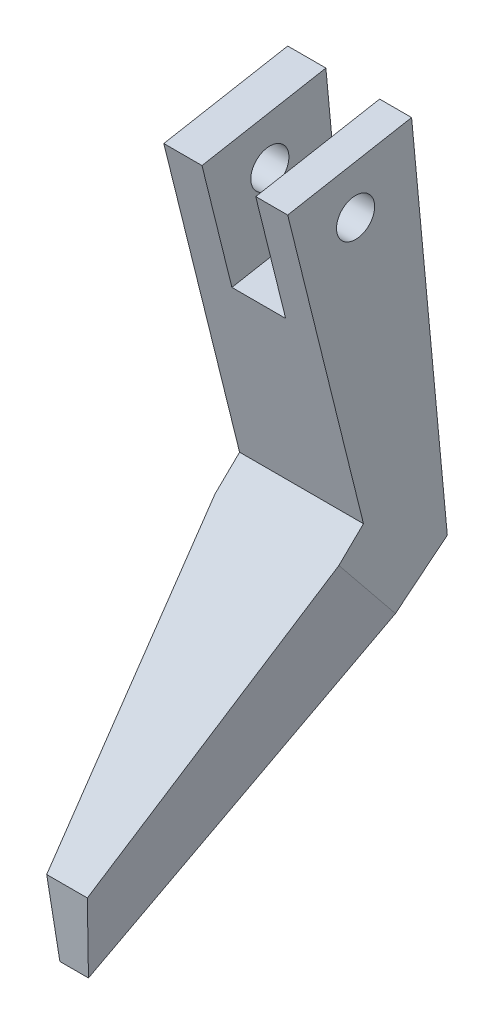
ISO-10303-21;
HEADER;
FILE_DESCRIPTION(('STEP AP214'),'2;1');
FILE_NAME('part.step','',(''),(''),'','','');
FILE_SCHEMA(('AUTOMOTIVE_DESIGN { 1 0 10303 214 1 1 1 1 }'));
ENDSEC;
DATA;
#1=APPLICATION_CONTEXT('core data for automotive mechanical design processes');
#2=APPLICATION_PROTOCOL_DEFINITION('international standard','automotive_design',2000,#1);
#3=PRODUCT_CONTEXT('',#1,'mechanical');
#4=PRODUCT('Part','Part','',(#3));
#5=PRODUCT_RELATED_PRODUCT_CATEGORY('part','',(#4));
#6=PRODUCT_DEFINITION_FORMATION('','',#4);
#7=PRODUCT_DEFINITION_CONTEXT('part definition',#1,'design');
#8=PRODUCT_DEFINITION('design','',#6,#7);
#9=PRODUCT_DEFINITION_SHAPE('','',#8);
#10=(LENGTH_UNIT() NAMED_UNIT(*) SI_UNIT(.MILLI.,.METRE.));
#11=(NAMED_UNIT(*) PLANE_ANGLE_UNIT() SI_UNIT($,.RADIAN.));
#12=(NAMED_UNIT(*) SI_UNIT($,.STERADIAN.) SOLID_ANGLE_UNIT());
#13=UNCERTAINTY_MEASURE_WITH_UNIT(LENGTH_MEASURE(1.E-05),#10,'distance_accuracy_value','');
#14=(GEOMETRIC_REPRESENTATION_CONTEXT(3) GLOBAL_UNCERTAINTY_ASSIGNED_CONTEXT((#13)) GLOBAL_UNIT_ASSIGNED_CONTEXT((#10,
#11,#12)) REPRESENTATION_CONTEXT('',''));
#15=CARTESIAN_POINT('',(0.,0.,0.));
#16=DIRECTION('',(0.,0.,1.));
#17=DIRECTION('',(1.,0.,0.));
#18=AXIS2_PLACEMENT_3D('',#15,#16,#17);
#19=CARTESIAN_POINT('',(130.,203.995173876658,117.413418414322));
#20=DIRECTION('',(0.,-0.983927715527539,-0.178567215962946));
#21=DIRECTION('',(0.,0.178567215962946,-0.98392771552754));
#22=AXIS2_PLACEMENT_3D('',#19,#20,#21);
#23=PLANE('',#22);
#24=DIRECTION('',(-1.,0.,0.));
#25=VECTOR('',#24,1.);
#26=CARTESIAN_POINT('',(130.,227.588104240183,-12.586581585678));
#27=LINE('',#26,#25);
#28=CARTESIAN_POINT('',(130.,227.588104240183,-12.586581585678));
#29=VERTEX_POINT('',#28);
#30=CARTESIAN_POINT('',(96.4614608723713,227.588104240183,-12.586581585678));
#31=VERTEX_POINT('',#30);
#32=EDGE_CURVE('E159',#29,#31,#27,.T.);
#33=ORIENTED_EDGE('',*,*,#32,.T.);
#34=DIRECTION('',(0.,0.178567215962946,-0.983927715527539));
#35=VECTOR('',#34,1.);
#36=CARTESIAN_POINT('',(96.4614608723713,203.995173876658,117.413418414322));
#37=LINE('',#36,#35);
#38=CARTESIAN_POINT('',(96.4614608723713,203.995173876658,117.413418414322));
#39=VERTEX_POINT('',#38);
#40=EDGE_CURVE('E133',#39,#31,#37,.T.);
#41=ORIENTED_EDGE('',*,*,#40,.F.);
#42=DIRECTION('',(-1.,0.,0.));
#43=VECTOR('',#42,1.);
#44=CARTESIAN_POINT('',(130.,203.995173876658,117.413418414322));
#45=LINE('',#44,#43);
#46=CARTESIAN_POINT('',(130.,203.995173876658,117.413418414322));
#47=VERTEX_POINT('',#46);
#48=EDGE_CURVE('E150',#47,#39,#45,.T.);
#49=ORIENTED_EDGE('',*,*,#48,.F.);
#50=DIRECTION('',(0.,-0.178567215962946,0.983927715527539));
#51=VECTOR('',#50,1.);
#52=CARTESIAN_POINT('',(130.,203.995173876658,117.413418414322));
#53=LINE('',#52,#51);
#54=EDGE_CURVE('E151',#29,#47,#53,.T.);
#55=ORIENTED_EDGE('',*,*,#54,.F.);
#56=EDGE_LOOP('',(#33,#41,#49,#55));
#57=FACE_BOUND('',#56,.T.);
#58=ADVANCED_FACE('F38',(#57),#23,.F.);
#59=CARTESIAN_POINT('',(130.,-116.282866202972,37.9025572521483));
#60=DIRECTION('',(0.,0.240942003521738,-0.97053951539282));
#61=DIRECTION('',(0.,0.970539515392821,0.240942003521738));
#62=AXIS2_PLACEMENT_3D('',#59,#60,#61);
#63=PLANE('',#62);
#64=ORIENTED_EDGE('',*,*,#48,.T.);
#65=DIRECTION('',(0.,-0.970539515392821,-0.240942003521738));
#66=VECTOR('',#65,1.);
#67=CARTESIAN_POINT('',(96.4614608723713,-116.282866202972,37.9025572521483));
#68=LINE('',#67,#66);
#69=CARTESIAN_POINT('',(96.4614608723713,77.567766075428,86.02708900417));
#70=VERTEX_POINT('',#69);
#71=EDGE_CURVE('E223',#39,#70,#68,.T.);
#72=ORIENTED_EDGE('',*,*,#71,.T.);
#73=DIRECTION('',(1.,0.,0.));
#74=VECTOR('',#73,1.);
#75=CARTESIAN_POINT('',(130.,77.567766075428,86.02708900417));
#76=LINE('',#75,#74);
#77=CARTESIAN_POINT('',(40.0610371133642,77.567766075428,86.02708900417));
#78=VERTEX_POINT('',#77);
#79=EDGE_CURVE('E143',#78,#70,#76,.T.);
#80=ORIENTED_EDGE('',*,*,#79,.F.);
#81=DIRECTION('',(0.,0.970539515392821,0.240942003521738));
#82=VECTOR('',#81,1.);
#83=CARTESIAN_POINT('',(40.0610371133642,-116.282866202972,37.9025572521483));
#84=LINE('',#83,#82);
#85=CARTESIAN_POINT('',(40.0610371133642,203.995173876658,117.413418414322));
#86=VERTEX_POINT('',#85);
#87=EDGE_CURVE('E128',#78,#86,#84,.T.);
#88=ORIENTED_EDGE('',*,*,#87,.T.);
#89=CARTESIAN_POINT('',(0.,203.995173876658,117.413418414322));
#90=VERTEX_POINT('',#89);
#91=EDGE_CURVE('E140',#86,#90,#45,.T.);
#92=ORIENTED_EDGE('',*,*,#91,.T.);
#93=DIRECTION('',(0.,-0.97053951539282,-0.240942003521738));
#94=VECTOR('',#93,1.);
#95=CARTESIAN_POINT('',(0.,-116.282866202972,37.9025572521483));
#96=LINE('',#95,#94);
#97=CARTESIAN_POINT('',(0.,-116.282866202972,37.9025572521483));
#98=VERTEX_POINT('',#97);
#99=EDGE_CURVE('E195',#90,#98,#96,.T.);
#100=ORIENTED_EDGE('',*,*,#99,.T.);
#101=DIRECTION('',(-1.,0.,0.));
#102=VECTOR('',#101,1.);
#103=CARTESIAN_POINT('',(130.,-116.282866202972,37.9025572521483));
#104=LINE('',#103,#102);
#105=CARTESIAN_POINT('',(130.,-116.282866202972,37.9025572521483));
#106=VERTEX_POINT('',#105);
#107=EDGE_CURVE('E171',#106,#98,#104,.T.);
#108=ORIENTED_EDGE('',*,*,#107,.F.);
#109=DIRECTION('',(0.,-0.97053951539282,-0.240942003521738));
#110=VECTOR('',#109,1.);
#111=CARTESIAN_POINT('',(130.,-116.282866202972,37.9025572521483));
#112=LINE('',#111,#110);
#113=EDGE_CURVE('E191',#47,#106,#112,.T.);
#114=ORIENTED_EDGE('',*,*,#113,.F.);
#115=EDGE_LOOP('',(#64,#72,#80,#88,#92,#100,#108,#114));
#116=FACE_BOUND('',#115,.T.);
#117=ADVANCED_FACE('F40',(#116),#63,.F.);
#118=CARTESIAN_POINT('',(130.,-355.150417332349,283.977318975946));
#119=DIRECTION('',(0.,-0.717536559192002,-0.696520844069223));
#120=DIRECTION('',(0.,0.696520844069223,-0.717536559192002));
#121=AXIS2_PLACEMENT_3D('',#118,#119,#120);
#122=PLANE('',#121);
#123=DIRECTION('',(-1.,0.,0.));
#124=VECTOR('',#123,1.);
#125=CARTESIAN_POINT('',(130.,-355.150417332349,283.977318975946));
#126=LINE('',#125,#124);
#127=CARTESIAN_POINT('',(86.3237385901728,-355.150417332349,283.977318975946));
#128=VERTEX_POINT('',#127);
#129=CARTESIAN_POINT('',(43.6762614098272,-355.150417332349,283.977318975946));
#130=VERTEX_POINT('',#129);
#131=EDGE_CURVE('E168',#128,#130,#126,.T.);
#132=ORIENTED_EDGE('',*,*,#131,.F.);
#133=DIRECTION('',(0.140855660423099,0.689576630461711,-0.710382821898056));
#134=VECTOR('',#133,1.);
#135=CARTESIAN_POINT('',(87.190289465117,-350.908108356815,279.607009298564));
#136=LINE('',#135,#134);
#137=CARTESIAN_POINT('',(130.,-141.327777307197,63.7031337776207));
#138=VERTEX_POINT('',#137);
#139=EDGE_CURVE('E198',#128,#138,#136,.T.);
#140=ORIENTED_EDGE('',*,*,#139,.T.);
#141=DIRECTION('',(0.,-0.696520844069223,0.717536559192002));
#142=VECTOR('',#141,1.);
#143=CARTESIAN_POINT('',(130.,-355.150417332349,283.977318975946));
#144=LINE('',#143,#142);
#145=EDGE_CURVE('E183',#106,#138,#144,.T.);
#146=ORIENTED_EDGE('',*,*,#145,.F.);
#147=ORIENTED_EDGE('',*,*,#107,.T.);
#148=DIRECTION('',(0.,-0.696520844069223,0.717536559192002));
#149=VECTOR('',#148,1.);
#150=CARTESIAN_POINT('',(0.,-355.150417332349,283.977318975946));
#151=LINE('',#150,#149);
#152=CARTESIAN_POINT('',(0.,-141.327777307197,63.7031337776207));
#153=VERTEX_POINT('',#152);
#154=EDGE_CURVE('E197',#98,#153,#151,.T.);
#155=ORIENTED_EDGE('',*,*,#154,.T.);
#156=DIRECTION('',(0.140855660423099,-0.689576630461711,0.710382821898056));
#157=VECTOR('',#156,1.);
#158=CARTESIAN_POINT('',(45.3889517544026,-363.535108677298,292.614996697682));
#159=LINE('',#158,#157);
#160=EDGE_CURVE('E213',#153,#130,#159,.T.);
#161=ORIENTED_EDGE('',*,*,#160,.T.);
#162=EDGE_LOOP('',(#132,#140,#146,#147,#155,#161));
#163=FACE_BOUND('',#162,.T.);
#164=ADVANCED_FACE('F266',(#163),#122,.F.);
#165=CARTESIAN_POINT('',(130.,-434.798684306352,276.483750531074));
#166=DIRECTION('',(0.,0.0936696055608934,-0.995603337175035));
#167=DIRECTION('',(0.,0.995603337175035,0.0936696055608935));
#168=AXIS2_PLACEMENT_3D('',#165,#166,#167);
#169=PLANE('',#168);
#170=DIRECTION('',(-1.,0.,0.));
#171=VECTOR('',#170,1.);
#172=CARTESIAN_POINT('',(130.,-434.798684306352,276.483750531074));
#173=LINE('',#172,#171);
#174=CARTESIAN_POINT('',(80.,-434.798684306352,276.483750531074));
#175=VERTEX_POINT('',#174);
#176=CARTESIAN_POINT('',(50.,-434.798684306352,276.483750531074));
#177=VERTEX_POINT('',#176);
#178=EDGE_CURVE('E165',#175,#177,#173,.T.);
#179=ORIENTED_EDGE('',*,*,#178,.F.);
#180=DIRECTION('',(0.0788009264529344,0.992507381262661,0.0933783279422699));
#181=VECTOR('',#180,1.);
#182=CARTESIAN_POINT('',(80.310479300492,-430.888159248608,276.851665468698));
#183=LINE('',#182,#181);
#184=EDGE_CURVE('E210',#175,#128,#183,.T.);
#185=ORIENTED_EDGE('',*,*,#184,.T.);
#186=ORIENTED_EDGE('',*,*,#131,.T.);
#187=DIRECTION('',(0.0788009264529344,-0.992507381262661,-0.0933783279422699));
#188=VECTOR('',#187,1.);
#189=CARTESIAN_POINT('',(50.4967668807873,-441.055524398742,275.895086630876));
#190=LINE('',#189,#188);
#191=EDGE_CURVE('E216',#130,#177,#190,.T.);
#192=ORIENTED_EDGE('',*,*,#191,.T.);
#193=EDGE_LOOP('',(#179,#185,#186,#192));
#194=FACE_BOUND('',#193,.T.);
#195=ADVANCED_FACE('F280',(#194),#169,.F.);
#196=CARTESIAN_POINT('',(130.,-170.653230629831,-50.0544238100355));
#197=DIRECTION('',(0.,0.777471843669309,0.628917746848859));
#198=DIRECTION('',(0.,-0.628917746848859,0.777471843669309));
#199=AXIS2_PLACEMENT_3D('',#196,#197,#198);
#200=PLANE('',#199);
#201=DIRECTION('',(0.,0.628917746848859,-0.777471843669309));
#202=VECTOR('',#201,1.);
#203=CARTESIAN_POINT('',(130.,-170.653230629831,-50.0544238100355));
#204=LINE('',#203,#202);
#205=CARTESIAN_POINT('',(130.,-214.677472909251,4.3686052468162));
#206=VERTEX_POINT('',#205);
#207=CARTESIAN_POINT('',(130.,-170.653230629831,-50.0544238100355));
#208=VERTEX_POINT('',#207);
#209=EDGE_CURVE('E180',#206,#208,#204,.T.);
#210=ORIENTED_EDGE('',*,*,#209,.F.);
#211=DIRECTION('',(0.14142135623731,0.62259680504755,-0.769657857976246));
#212=VECTOR('',#211,1.);
#213=CARTESIAN_POINT('',(130.,-214.677472909251,4.36860524681608));
#214=LINE('',#213,#212);
#215=EDGE_CURVE('E62',#175,#206,#214,.T.);
#216=ORIENTED_EDGE('',*,*,#215,.F.);
#217=ORIENTED_EDGE('',*,*,#178,.T.);
#218=DIRECTION('',(0.14142135623731,-0.62259680504755,0.769657857976246));
#219=VECTOR('',#218,1.);
#220=CARTESIAN_POINT('',(50.,-434.798684306352,276.483750531074));
#221=LINE('',#220,#219);
#222=CARTESIAN_POINT('',(0.,-214.677472909251,4.36860524681608));
#223=VERTEX_POINT('',#222);
#224=EDGE_CURVE('E219',#223,#177,#221,.T.);
#225=ORIENTED_EDGE('',*,*,#224,.F.);
#226=DIRECTION('',(0.,0.628917746848859,-0.777471843669309));
#227=VECTOR('',#226,1.);
#228=CARTESIAN_POINT('',(0.,-170.653230629831,-50.0544238100355));
#229=LINE('',#228,#227);
#230=CARTESIAN_POINT('',(0.,-170.653230629831,-50.0544238100355));
#231=VERTEX_POINT('',#230);
#232=EDGE_CURVE('E201',#223,#231,#229,.T.);
#233=ORIENTED_EDGE('',*,*,#232,.T.);
#234=DIRECTION('',(-1.,0.,0.));
#235=VECTOR('',#234,1.);
#236=CARTESIAN_POINT('',(130.,-170.653230629831,-50.0544238100355));
#237=LINE('',#236,#235);
#238=EDGE_CURVE('E162',#208,#231,#237,.T.);
#239=ORIENTED_EDGE('',*,*,#238,.F.);
#240=EDGE_LOOP('',(#210,#216,#217,#225,#233,#239));
#241=FACE_BOUND('',#240,.T.);
#242=ADVANCED_FACE('F186',(#241),#200,.F.);
#243=CARTESIAN_POINT('',(130.,227.588104240183,-12.586581585678));
#244=DIRECTION('',(0.,-0.0936696055608935,0.995603337175035));
#245=DIRECTION('',(0.,-0.995603337175035,-0.0936696055608935));
#246=AXIS2_PLACEMENT_3D('',#243,#244,#245);
#247=PLANE('',#246);
#248=DIRECTION('',(-1.,0.,0.));
#249=VECTOR('',#248,1.);
#250=CARTESIAN_POINT('',(130.,97.6826625363831,-24.8085087631573));
#251=LINE('',#250,#249);
#252=CARTESIAN_POINT('',(96.4614608723713,97.6826625363831,-24.8085087631573));
#253=VERTEX_POINT('',#252);
#254=CARTESIAN_POINT('',(40.0610371133642,97.6826625363831,-24.8085087631573));
#255=VERTEX_POINT('',#254);
#256=EDGE_CURVE('E11',#253,#255,#251,.T.);
#257=ORIENTED_EDGE('',*,*,#256,.F.);
#258=DIRECTION('',(0.,0.995603337175035,0.0936696055608935));
#259=VECTOR('',#258,1.);
#260=CARTESIAN_POINT('',(96.4614608723713,227.588104240183,-12.586581585678));
#261=LINE('',#260,#259);
#262=EDGE_CURVE('E144',#253,#31,#261,.T.);
#263=ORIENTED_EDGE('',*,*,#262,.T.);
#264=ORIENTED_EDGE('',*,*,#32,.F.);
#265=DIRECTION('',(0.,0.995603337175035,0.0936696055608935));
#266=VECTOR('',#265,1.);
#267=CARTESIAN_POINT('',(130.,227.588104240183,-12.586581585678));
#268=LINE('',#267,#266);
#269=EDGE_CURVE('E154',#208,#29,#268,.T.);
#270=ORIENTED_EDGE('',*,*,#269,.F.);
#271=ORIENTED_EDGE('',*,*,#238,.T.);
#272=DIRECTION('',(0.,0.995603337175035,0.0936696055608935));
#273=VECTOR('',#272,1.);
#274=CARTESIAN_POINT('',(0.,227.588104240183,-12.586581585678));
#275=LINE('',#274,#273);
#276=CARTESIAN_POINT('',(0.,227.588104240183,-12.586581585678));
#277=VERTEX_POINT('',#276);
#278=EDGE_CURVE('E202',#231,#277,#275,.T.);
#279=ORIENTED_EDGE('',*,*,#278,.T.);
#280=CARTESIAN_POINT('',(40.0610371133642,227.588104240183,-12.586581585678));
#281=VERTEX_POINT('',#280);
#282=EDGE_CURVE('E153',#281,#277,#27,.T.);
#283=ORIENTED_EDGE('',*,*,#282,.F.);
#284=DIRECTION('',(0.,-0.995603337175035,-0.0936696055608935));
#285=VECTOR('',#284,1.);
#286=CARTESIAN_POINT('',(40.0610371133642,227.588104240183,-12.586581585678));
#287=LINE('',#286,#285);
#288=EDGE_CURVE('E54',#281,#255,#287,.T.);
#289=ORIENTED_EDGE('',*,*,#288,.T.);
#290=EDGE_LOOP('',(#257,#263,#264,#270,#271,#279,#283,#289));
#291=FACE_BOUND('',#290,.T.);
#292=ADVANCED_FACE('F270',(#291),#247,.F.);
#293=ORIENTED_EDGE('',*,*,#91,.F.);
#294=DIRECTION('',(0.,-0.178567215962946,0.983927715527539));
#295=VECTOR('',#294,1.);
#296=CARTESIAN_POINT('',(40.0610371133642,227.588104240183,-12.586581585678));
#297=LINE('',#296,#295);
#298=EDGE_CURVE('E125',#281,#86,#297,.T.);
#299=ORIENTED_EDGE('',*,*,#298,.F.);
#300=ORIENTED_EDGE('',*,*,#282,.T.);
#301=DIRECTION('',(0.,-0.178567215962946,0.983927715527539));
#302=VECTOR('',#301,1.);
#303=CARTESIAN_POINT('',(0.,203.995173876658,117.413418414322));
#304=LINE('',#303,#302);
#305=EDGE_CURVE('E148',#277,#90,#304,.T.);
#306=ORIENTED_EDGE('',*,*,#305,.T.);
#307=EDGE_LOOP('',(#293,#299,#300,#306));
#308=FACE_BOUND('',#307,.T.);
#309=ADVANCED_FACE('F146',(#308),#23,.F.);
#310=CARTESIAN_POINT('',(130.,0.,0.));
#311=DIRECTION('',(-1.,0.,0.));
#312=DIRECTION('',(0.,0.,1.));
#313=AXIS2_PLACEMENT_3D('',#310,#311,#312);
#314=PLANE('',#313);
#315=CARTESIAN_POINT('',(130.,166.178708674821,46.2039789265663));
#316=DIRECTION('',(-1.,0.,0.));
#317=DIRECTION('',(0.,0.,1.));
#318=AXIS2_PLACEMENT_3D('',#315,#316,#317);
#319=CIRCLE('',#318,20.);
#320=CARTESIAN_POINT('',(130.,166.178708674821,66.2039789265663));
#321=VERTEX_POINT('',#320);
#322=EDGE_CURVE('E239',#321,#321,#319,.T.);
#323=ORIENTED_EDGE('',*,*,#322,.T.);
#324=EDGE_LOOP('',(#323));
#325=FACE_BOUND('',#324,.T.);
#326=ORIENTED_EDGE('',*,*,#145,.T.);
#327=DIRECTION('',(0.,-0.777471843669309,-0.628917746848859));
#328=VECTOR('',#327,1.);
#329=CARTESIAN_POINT('',(130.,-87.0490966100679,107.610608812159));
#330=LINE('',#329,#328);
#331=EDGE_CURVE('E47',#138,#206,#330,.T.);
#332=ORIENTED_EDGE('',*,*,#331,.T.);
#333=ORIENTED_EDGE('',*,*,#209,.T.);
#334=ORIENTED_EDGE('',*,*,#269,.T.);
#335=ORIENTED_EDGE('',*,*,#54,.T.);
#336=ORIENTED_EDGE('',*,*,#113,.T.);
#337=EDGE_LOOP('',(#326,#332,#333,#334,#335,#336));
#338=FACE_BOUND('',#337,.T.);
#339=ADVANCED_FACE('F179',(#325,#338),#314,.F.);
#340=CARTESIAN_POINT('',(0.,0.,0.));
#341=DIRECTION('',(-1.,0.,0.));
#342=DIRECTION('',(0.,0.,1.));
#343=AXIS2_PLACEMENT_3D('',#340,#341,#342);
#344=PLANE('',#343);
#345=CARTESIAN_POINT('',(0.,166.178708674821,46.2039789265663));
#346=DIRECTION('',(-1.,0.,0.));
#347=DIRECTION('',(0.,0.,1.));
#348=AXIS2_PLACEMENT_3D('',#345,#346,#347);
#349=CIRCLE('',#348,20.);
#350=CARTESIAN_POINT('',(0.,166.178708674821,66.2039789265663));
#351=VERTEX_POINT('',#350);
#352=EDGE_CURVE('E236',#351,#351,#349,.T.);
#353=ORIENTED_EDGE('',*,*,#352,.F.);
#354=EDGE_LOOP('',(#353));
#355=FACE_BOUND('',#354,.T.);
#356=DIRECTION('',(0.,-0.777471843669309,-0.628917746848859));
#357=VECTOR('',#356,1.);
#358=CARTESIAN_POINT('',(0.,-87.0490966100679,107.610608812159));
#359=LINE('',#358,#357);
#360=EDGE_CURVE('E174',#153,#223,#359,.T.);
#361=ORIENTED_EDGE('',*,*,#360,.F.);
#362=ORIENTED_EDGE('',*,*,#154,.F.);
#363=ORIENTED_EDGE('',*,*,#99,.F.);
#364=ORIENTED_EDGE('',*,*,#305,.F.);
#365=ORIENTED_EDGE('',*,*,#278,.F.);
#366=ORIENTED_EDGE('',*,*,#232,.F.);
#367=EDGE_LOOP('',(#361,#362,#363,#364,#365,#366));
#368=FACE_BOUND('',#367,.T.);
#369=ADVANCED_FACE('F275',(#355,#368),#344,.T.);
#370=CARTESIAN_POINT('',(50.,-333.727344629342,358.243057621426));
#371=DIRECTION('',(0.989949493661166,0.0889424007210785,-0.109951122568035));
#372=DIRECTION('',(-0.110388617930474,0.,-0.993888501307566));
#373=AXIS2_PLACEMENT_3D('',#370,#371,#372);
#374=PLANE('',#373);
#375=ORIENTED_EDGE('',*,*,#360,.T.);
#376=ORIENTED_EDGE('',*,*,#224,.T.);
#377=ORIENTED_EDGE('',*,*,#191,.F.);
#378=ORIENTED_EDGE('',*,*,#160,.F.);
#379=EDGE_LOOP('',(#375,#376,#377,#378));
#380=FACE_BOUND('',#379,.T.);
#381=ADVANCED_FACE('F294',(#380),#374,.F.);
#382=CARTESIAN_POINT('',(130.,-113.606133232241,86.1279123371678));
#383=DIRECTION('',(-0.989949493661166,0.0889424007210785,-0.109951122568035));
#384=DIRECTION('',(-0.110388617930474,0.,0.993888501307566));
#385=AXIS2_PLACEMENT_3D('',#382,#383,#384);
#386=PLANE('',#385);
#387=ORIENTED_EDGE('',*,*,#184,.F.);
#388=ORIENTED_EDGE('',*,*,#215,.T.);
#389=ORIENTED_EDGE('',*,*,#331,.F.);
#390=ORIENTED_EDGE('',*,*,#139,.F.);
#391=EDGE_LOOP('',(#387,#388,#389,#390));
#392=FACE_BOUND('',#391,.T.);
#393=ADVANCED_FACE('F291',(#392),#386,.F.);
#394=CARTESIAN_POINT('',(0.,90.2091423365047,16.3715231792187));
#395=DIRECTION('',(0.,0.983927715527539,0.178567215962946));
#396=DIRECTION('',(0.,-0.178567215962946,0.983927715527539));
#397=AXIS2_PLACEMENT_3D('',#394,#395,#396);
#398=PLANE('',#397);
#399=ORIENTED_EDGE('',*,*,#79,.T.);
#400=DIRECTION('',(0.,0.178567215962946,-0.983927715527539));
#401=VECTOR('',#400,1.);
#402=CARTESIAN_POINT('',(96.4614608723713,76.0845708580782,94.199680339139));
#403=LINE('',#402,#401);
#404=EDGE_CURVE('E228',#70,#253,#403,.T.);
#405=ORIENTED_EDGE('',*,*,#404,.T.);
#406=ORIENTED_EDGE('',*,*,#256,.T.);
#407=DIRECTION('',(0.,-0.178567215962946,0.983927715527539));
#408=VECTOR('',#407,1.);
#409=CARTESIAN_POINT('',(40.0610371133642,99.6775012216028,-35.8003196608611));
#410=LINE('',#409,#408);
#411=EDGE_CURVE('E229',#255,#78,#410,.T.);
#412=ORIENTED_EDGE('',*,*,#411,.T.);
#413=EDGE_LOOP('',(#399,#405,#406,#412));
#414=FACE_BOUND('',#413,.T.);
#415=ADVANCED_FACE('F293',(#414),#398,.T.);
#416=CARTESIAN_POINT('',(96.4614608723713,76.0845708580782,94.199680339139));
#417=DIRECTION('',(1.,0.,0.));
#418=DIRECTION('',(0.,0.,-1.));
#419=AXIS2_PLACEMENT_3D('',#416,#417,#418);
#420=PLANE('',#419);
#421=CARTESIAN_POINT('',(96.4614608723713,166.178708674821,46.2039789265663));
#422=DIRECTION('',(1.,0.,0.));
#423=DIRECTION('',(0.,0.,-1.));
#424=AXIS2_PLACEMENT_3D('',#421,#422,#423);
#425=CIRCLE('',#424,20.);
#426=CARTESIAN_POINT('',(96.4614608723713,166.178708674821,26.2039789265663));
#427=VERTEX_POINT('',#426);
#428=EDGE_CURVE('E134',#427,#427,#425,.T.);
#429=ORIENTED_EDGE('',*,*,#428,.T.);
#430=EDGE_LOOP('',(#429));
#431=FACE_BOUND('',#430,.T.);
#432=ORIENTED_EDGE('',*,*,#40,.T.);
#433=ORIENTED_EDGE('',*,*,#262,.F.);
#434=ORIENTED_EDGE('',*,*,#404,.F.);
#435=ORIENTED_EDGE('',*,*,#71,.F.);
#436=EDGE_LOOP('',(#432,#433,#434,#435));
#437=FACE_BOUND('',#436,.T.);
#438=ADVANCED_FACE('F257',(#431,#437),#420,.F.);
#439=CARTESIAN_POINT('',(40.0610371133642,99.6775012216028,-35.8003196608611));
#440=DIRECTION('',(-1.,0.,0.));
#441=DIRECTION('',(0.,0.,1.));
#442=AXIS2_PLACEMENT_3D('',#439,#440,#441);
#443=PLANE('',#442);
#444=CARTESIAN_POINT('',(40.0610371133642,166.178708674821,46.2039789265663));
#445=DIRECTION('',(-1.,0.,0.));
#446=DIRECTION('',(0.,0.,1.));
#447=AXIS2_PLACEMENT_3D('',#444,#445,#446);
#448=CIRCLE('',#447,20.);
#449=CARTESIAN_POINT('',(40.0610371133642,166.178708674821,66.2039789265663));
#450=VERTEX_POINT('',#449);
#451=EDGE_CURVE('E42',#450,#450,#448,.T.);
#452=ORIENTED_EDGE('',*,*,#451,.T.);
#453=EDGE_LOOP('',(#452));
#454=FACE_BOUND('',#453,.T.);
#455=ORIENTED_EDGE('',*,*,#411,.F.);
#456=ORIENTED_EDGE('',*,*,#288,.F.);
#457=ORIENTED_EDGE('',*,*,#298,.T.);
#458=ORIENTED_EDGE('',*,*,#87,.F.);
#459=EDGE_LOOP('',(#455,#456,#457,#458));
#460=FACE_BOUND('',#459,.T.);
#461=ADVANCED_FACE('F127',(#454,#460),#443,.F.);
#462=CARTESIAN_POINT('',(130.,166.178708674821,46.2039789265663));
#463=DIRECTION('',(-1.,0.,0.));
#464=DIRECTION('',(0.,0.,1.));
#465=AXIS2_PLACEMENT_3D('',#462,#463,#464);
#466=CYLINDRICAL_SURFACE('',#465,20.);
#467=ORIENTED_EDGE('',*,*,#352,.T.);
#468=EDGE_LOOP('',(#467));
#469=FACE_BOUND('',#468,.T.);
#470=ORIENTED_EDGE('',*,*,#451,.F.);
#471=EDGE_LOOP('',(#470));
#472=FACE_BOUND('',#471,.T.);
#473=ADVANCED_FACE('F247',(#469,#472),#466,.F.);
#474=ORIENTED_EDGE('',*,*,#322,.F.);
#475=EDGE_LOOP('',(#474));
#476=FACE_BOUND('',#475,.T.);
#477=ORIENTED_EDGE('',*,*,#428,.F.);
#478=EDGE_LOOP('',(#477));
#479=FACE_BOUND('',#478,.T.);
#480=ADVANCED_FACE('F249',(#476,#479),#466,.F.);
#481=CLOSED_SHELL('',(#58,#117,#164,#195,#242,#292,#309,#339,#369,#381,#393,#415,#438,#461,#473,#480));
#482=MANIFOLD_SOLID_BREP('B2',#481);
#483=ADVANCED_BREP_SHAPE_REPRESENTATION('',(#18,#482),#14);
#484=SHAPE_DEFINITION_REPRESENTATION(#9,#483);
ENDSEC;
END-ISO-10303-21;
